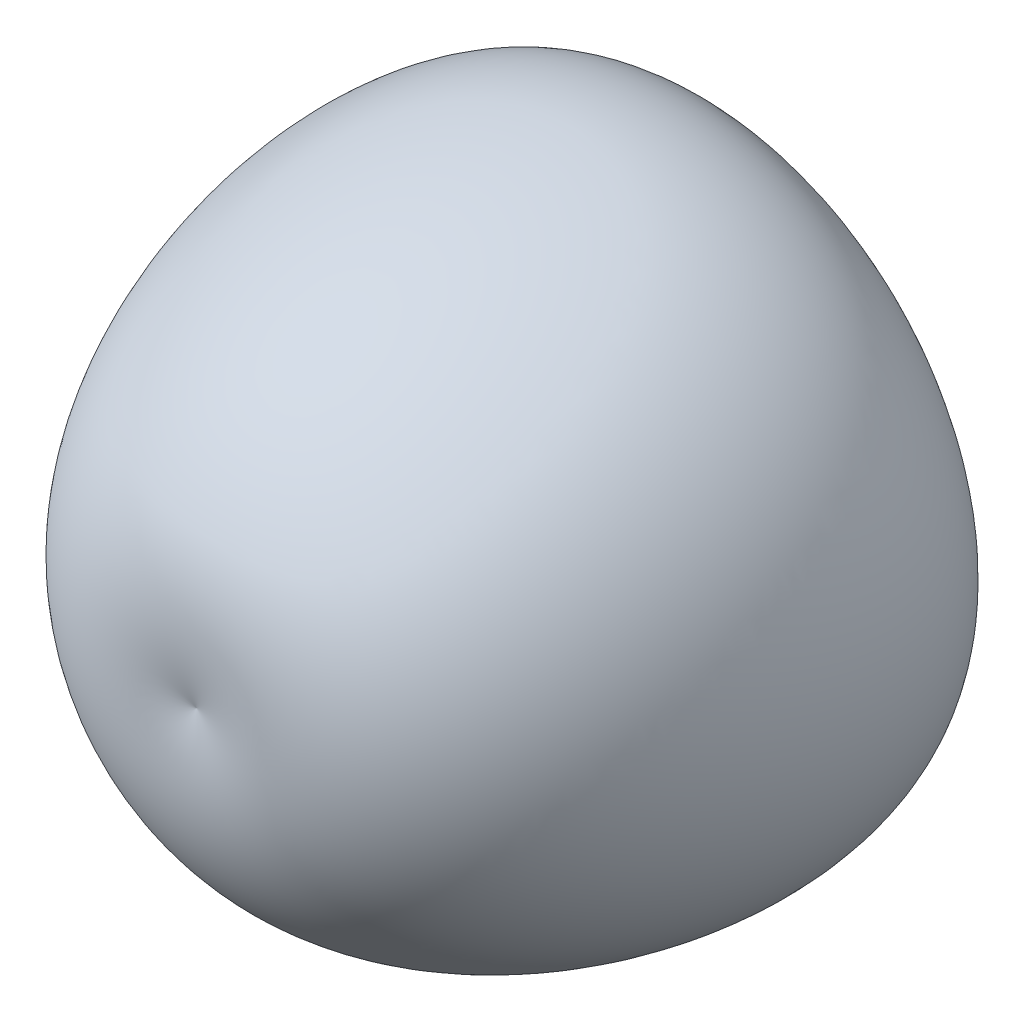
ISO-10303-21;
HEADER;
FILE_DESCRIPTION(('STEP AP214'),'2;1');
FILE_NAME('part.step','',(''),(''),'','','');
FILE_SCHEMA(('AUTOMOTIVE_DESIGN { 1 0 10303 214 1 1 1 1 }'));
ENDSEC;
DATA;
#1=APPLICATION_CONTEXT('core data for automotive mechanical design processes');
#2=APPLICATION_PROTOCOL_DEFINITION('international standard','automotive_design',2000,#1);
#3=PRODUCT_CONTEXT('',#1,'mechanical');
#4=PRODUCT('Part','Part','',(#3));
#5=PRODUCT_RELATED_PRODUCT_CATEGORY('part','',(#4));
#6=PRODUCT_DEFINITION_FORMATION('','',#4);
#7=PRODUCT_DEFINITION_CONTEXT('part definition',#1,'design');
#8=PRODUCT_DEFINITION('design','',#6,#7);
#9=PRODUCT_DEFINITION_SHAPE('','',#8);
#10=(LENGTH_UNIT() NAMED_UNIT(*) SI_UNIT(.MILLI.,.METRE.));
#11=(NAMED_UNIT(*) PLANE_ANGLE_UNIT() SI_UNIT($,.RADIAN.));
#12=(NAMED_UNIT(*) SI_UNIT($,.STERADIAN.) SOLID_ANGLE_UNIT());
#13=UNCERTAINTY_MEASURE_WITH_UNIT(LENGTH_MEASURE(1.E-05),#10,'distance_accuracy_value','');
#14=(GEOMETRIC_REPRESENTATION_CONTEXT(3) GLOBAL_UNCERTAINTY_ASSIGNED_CONTEXT((#13)) GLOBAL_UNIT_ASSIGNED_CONTEXT((#10,
#11,#12)) REPRESENTATION_CONTEXT('',''));
#15=CARTESIAN_POINT('',(0.,0.,0.));
#16=DIRECTION('',(0.,0.,1.));
#17=DIRECTION('',(1.,0.,0.));
#18=AXIS2_PLACEMENT_3D('',#15,#16,#17);
#19=CARTESIAN_POINT('',(0.,0.,-22.));
#20=DIRECTION('',(0.,0.,1.));
#21=DIRECTION('',(1.,0.,0.));
#22=AXIS2_PLACEMENT_3D('',#19,#20,#21);
#23=CYLINDRICAL_SURFACE('',#22,0.5);
#24=CARTESIAN_POINT('',(0.,0.,-22.));
#25=DIRECTION('',(0.,0.,1.));
#26=DIRECTION('',(1.,0.,0.));
#27=AXIS2_PLACEMENT_3D('',#24,#25,#26);
#28=CIRCLE('',#27,0.5);
#29=CARTESIAN_POINT('',(0.5,0.,-22.));
#30=VERTEX_POINT('',#29);
#31=EDGE_CURVE('E44',#30,#30,#28,.T.);
#32=ORIENTED_EDGE('',*,*,#31,.T.);
#33=EDGE_LOOP('',(#32));
#34=FACE_BOUND('',#33,.T.);
#35=CARTESIAN_POINT('',(0.,0.,-15.4333651920756));
#36=DIRECTION('',(0.,0.,-1.));
#37=DIRECTION('',(-1.,0.,0.));
#38=AXIS2_PLACEMENT_3D('',#35,#36,#37);
#39=CIRCLE('',#38,0.499999999999999);
#40=CARTESIAN_POINT('',(-0.499999999999999,0.,-15.4333651920756));
#41=VERTEX_POINT('',#40);
#42=EDGE_CURVE('E11',#41,#41,#39,.F.);
#43=ORIENTED_EDGE('',*,*,#42,.F.);
#44=EDGE_LOOP('',(#43));
#45=FACE_BOUND('',#44,.T.);
#46=ADVANCED_FACE('F37',(#34,#45),#23,.T.);
#47=CARTESIAN_POINT('',(0.,0.,-22.));
#48=DIRECTION('',(0.,0.,1.));
#49=DIRECTION('',(1.,0.,0.));
#50=AXIS2_PLACEMENT_3D('',#47,#48,#49);
#51=PLANE('',#50);
#52=ORIENTED_EDGE('',*,*,#31,.F.);
#53=EDGE_LOOP('',(#52));
#54=FACE_BOUND('',#53,.T.);
#55=ADVANCED_FACE('F48',(#54),#51,.F.);
#56=CARTESIAN_POINT('',(0.,0.,0.));
#57=CARTESIAN_POINT('',(13.5334941984601,0.,3.92140522503407));
#58=CARTESIAN_POINT('',(17.2074767394052,0.,-30.2181543332925));
#59=CARTESIAN_POINT('',(0.,0.,-15.));
#60=B_SPLINE_CURVE_WITH_KNOTS('',3,(#56,#57,#58,#59),.UNSPECIFIED.,.F.,.F.,(4,4),(0.,1.),.UNSPECIFIED.);
#61=CARTESIAN_POINT('',(0.,0.,-15.));
#62=DIRECTION('',(0.,0.,-1.));
#63=AXIS1_PLACEMENT('',#61,#62);
#64=SURFACE_OF_REVOLUTION('',#60,#63);
#65=ORIENTED_EDGE('',*,*,#42,.T.);
#66=EDGE_LOOP('',(#65));
#67=FACE_BOUND('',#66,.T.);
#68=CARTESIAN_POINT('',(0.,0.,0.));
#69=VERTEX_POINT('',#68);
#70=VERTEX_LOOP('',#69);
#71=FACE_BOUND('',#70,.T.);
#72=ADVANCED_FACE('F39',(#67,#71),#64,.T.);
#73=CLOSED_SHELL('',(#46,#55,#72));
#74=MANIFOLD_SOLID_BREP('B2',#73);
#75=ADVANCED_BREP_SHAPE_REPRESENTATION('',(#18,#74),#14);
#76=SHAPE_DEFINITION_REPRESENTATION(#9,#75);
ENDSEC;
END-ISO-10303-21;
